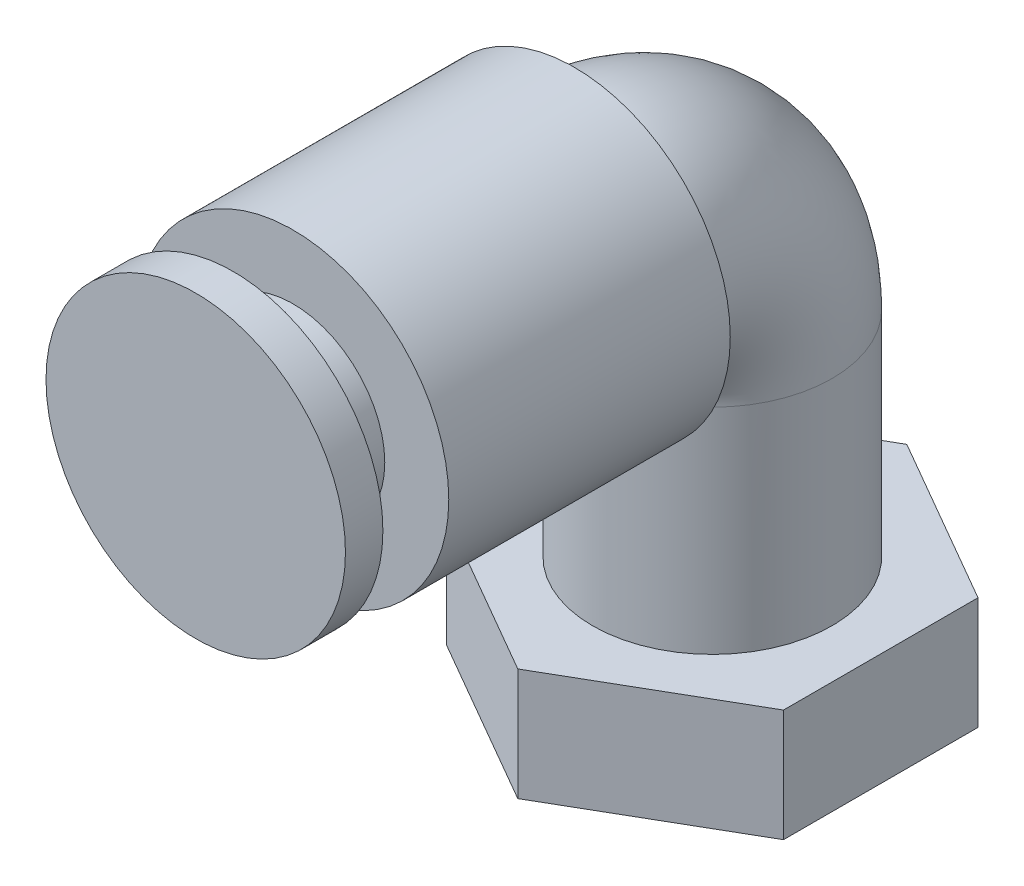
ISO-10303-21;
HEADER;
FILE_DESCRIPTION(('STEP AP214'),'2;1');
FILE_NAME('part.step','',(''),(''),'','','');
FILE_SCHEMA(('AUTOMOTIVE_DESIGN { 1 0 10303 214 1 1 1 1 }'));
ENDSEC;
DATA;
#1=APPLICATION_CONTEXT('core data for automotive mechanical design processes');
#2=APPLICATION_PROTOCOL_DEFINITION('international standard','automotive_design',2000,#1);
#3=PRODUCT_CONTEXT('',#1,'mechanical');
#4=PRODUCT('Part','Part','',(#3));
#5=PRODUCT_RELATED_PRODUCT_CATEGORY('part','',(#4));
#6=PRODUCT_DEFINITION_FORMATION('','',#4);
#7=PRODUCT_DEFINITION_CONTEXT('part definition',#1,'design');
#8=PRODUCT_DEFINITION('design','',#6,#7);
#9=PRODUCT_DEFINITION_SHAPE('','',#8);
#10=(LENGTH_UNIT() NAMED_UNIT(*) SI_UNIT(.MILLI.,.METRE.));
#11=(NAMED_UNIT(*) PLANE_ANGLE_UNIT() SI_UNIT($,.RADIAN.));
#12=(NAMED_UNIT(*) SI_UNIT($,.STERADIAN.) SOLID_ANGLE_UNIT());
#13=UNCERTAINTY_MEASURE_WITH_UNIT(LENGTH_MEASURE(1.E-05),#10,'distance_accuracy_value','');
#14=(GEOMETRIC_REPRESENTATION_CONTEXT(3) GLOBAL_UNCERTAINTY_ASSIGNED_CONTEXT((#13)) GLOBAL_UNIT_ASSIGNED_CONTEXT((#10,
#11,#12)) REPRESENTATION_CONTEXT('',''));
#15=CARTESIAN_POINT('',(0.,0.,0.));
#16=DIRECTION('',(0.,0.,1.));
#17=DIRECTION('',(1.,0.,0.));
#18=AXIS2_PLACEMENT_3D('',#15,#16,#17);
#19=CARTESIAN_POINT('',(0.,19.05,5.207));
#20=DIRECTION('',(0.,0.,1.));
#21=DIRECTION('',(0.,-1.,0.));
#22=AXIS2_PLACEMENT_3D('',#19,#20,#21);
#23=CYLINDRICAL_SURFACE('',#22,5.08);
#24=CARTESIAN_POINT('',(0.,19.05,5.207));
#25=DIRECTION('',(0.,0.,1.));
#26=DIRECTION('',(0.,-1.,0.));
#27=AXIS2_PLACEMENT_3D('',#24,#25,#26);
#28=CIRCLE('',#27,5.08);
#29=CARTESIAN_POINT('',(0.,24.13,5.207));
#30=VERTEX_POINT('',#29);
#31=EDGE_CURVE('E142',#30,#30,#28,.T.);
#32=ORIENTED_EDGE('',*,*,#31,.T.);
#33=EDGE_LOOP('',(#32));
#34=FACE_BOUND('',#33,.T.);
#35=CARTESIAN_POINT('',(0.,19.05,5.842));
#36=DIRECTION('',(0.,0.,1.));
#37=DIRECTION('',(1.,0.,0.));
#38=AXIS2_PLACEMENT_3D('',#35,#36,#37);
#39=CIRCLE('',#38,5.08);
#40=CARTESIAN_POINT('',(5.08,19.05,5.842));
#41=VERTEX_POINT('',#40);
#42=EDGE_CURVE('E53',#41,#41,#39,.F.);
#43=ORIENTED_EDGE('',*,*,#42,.T.);
#44=EDGE_LOOP('',(#43));
#45=FACE_BOUND('',#44,.T.);
#46=ADVANCED_FACE('F49',(#34,#45),#23,.T.);
#47=CARTESIAN_POINT('',(7.14374999999995,4.7625,-4.12444598552347));
#48=DIRECTION('',(-0.499999999999995,0.,0.866025403784441));
#49=DIRECTION('',(0.866025403784441,0.,0.499999999999995));
#50=AXIS2_PLACEMENT_3D('',#47,#48,#49);
#51=PLANE('',#50);
#52=DIRECTION('',(-0.866025403784442,0.,-0.499999999999995));
#53=VECTOR('',#52,1.);
#54=CARTESIAN_POINT('',(7.14374999999995,0.,-4.12444598552347));
#55=LINE('',#54,#53);
#56=CARTESIAN_POINT('',(7.14374999999995,0.,-4.12444598552347));
#57=VERTEX_POINT('',#56);
#58=CARTESIAN_POINT('',(0.,0.,-8.24889197104678));
#59=VERTEX_POINT('',#58);
#60=EDGE_CURVE('E138',#57,#59,#55,.T.);
#61=ORIENTED_EDGE('',*,*,#60,.T.);
#62=DIRECTION('',(0.,-1.,0.));
#63=VECTOR('',#62,1.);
#64=CARTESIAN_POINT('',(0.,4.7625,-8.24889197104678));
#65=LINE('',#64,#63);
#66=CARTESIAN_POINT('',(0.,4.7625,-8.24889197104678));
#67=VERTEX_POINT('',#66);
#68=EDGE_CURVE('E155',#67,#59,#65,.T.);
#69=ORIENTED_EDGE('',*,*,#68,.F.);
#70=DIRECTION('',(-0.866025403784442,0.,-0.499999999999995));
#71=VECTOR('',#70,1.);
#72=CARTESIAN_POINT('',(7.14374999999995,4.7625,-4.12444598552347));
#73=LINE('',#72,#71);
#74=CARTESIAN_POINT('',(7.14374999999995,4.7625,-4.12444598552347));
#75=VERTEX_POINT('',#74);
#76=EDGE_CURVE('E149',#75,#67,#73,.T.);
#77=ORIENTED_EDGE('',*,*,#76,.F.);
#78=DIRECTION('',(0.,-1.,0.));
#79=VECTOR('',#78,1.);
#80=CARTESIAN_POINT('',(7.14374999999995,4.7625,-4.12444598552347));
#81=LINE('',#80,#79);
#82=EDGE_CURVE('E134',#75,#57,#81,.T.);
#83=ORIENTED_EDGE('',*,*,#82,.T.);
#84=EDGE_LOOP('',(#61,#69,#77,#83));
#85=FACE_BOUND('',#84,.T.);
#86=ADVANCED_FACE('F51',(#85),#51,.F.);
#87=CARTESIAN_POINT('',(0.,4.7625,-8.24889197104678));
#88=DIRECTION('',(0.500000000000001,0.,0.866025403784438));
#89=DIRECTION('',(0.866025403784438,0.,-0.500000000000001));
#90=AXIS2_PLACEMENT_3D('',#87,#88,#89);
#91=PLANE('',#90);
#92=DIRECTION('',(-0.866025403784438,0.,0.500000000000001));
#93=VECTOR('',#92,1.);
#94=CARTESIAN_POINT('',(0.,0.,-8.24889197104678));
#95=LINE('',#94,#93);
#96=CARTESIAN_POINT('',(-7.14375000000001,0.,-4.12444598552337));
#97=VERTEX_POINT('',#96);
#98=EDGE_CURVE('E141',#59,#97,#95,.T.);
#99=ORIENTED_EDGE('',*,*,#98,.T.);
#100=DIRECTION('',(0.,-1.,0.));
#101=VECTOR('',#100,1.);
#102=CARTESIAN_POINT('',(-7.14375000000001,4.7625,-4.12444598552337));
#103=LINE('',#102,#101);
#104=CARTESIAN_POINT('',(-7.14375000000001,4.7625,-4.12444598552337));
#105=VERTEX_POINT('',#104);
#106=EDGE_CURVE('E153',#105,#97,#103,.T.);
#107=ORIENTED_EDGE('',*,*,#106,.F.);
#108=DIRECTION('',(-0.866025403784438,0.,0.500000000000001));
#109=VECTOR('',#108,1.);
#110=CARTESIAN_POINT('',(0.,4.7625,-8.24889197104678));
#111=LINE('',#110,#109);
#112=EDGE_CURVE('E107',#67,#105,#111,.T.);
#113=ORIENTED_EDGE('',*,*,#112,.F.);
#114=ORIENTED_EDGE('',*,*,#68,.T.);
#115=EDGE_LOOP('',(#99,#107,#113,#114));
#116=FACE_BOUND('',#115,.T.);
#117=ADVANCED_FACE('F173',(#116),#91,.F.);
#118=CARTESIAN_POINT('',(-7.14375000000001,4.7625,-4.12444598552337));
#119=DIRECTION('',(1.,0.,0.));
#120=DIRECTION('',(0.,0.,-1.));
#121=AXIS2_PLACEMENT_3D('',#118,#119,#120);
#122=PLANE('',#121);
#123=DIRECTION('',(0.,0.,1.));
#124=VECTOR('',#123,1.);
#125=CARTESIAN_POINT('',(-7.14375000000001,0.,-4.12444598552337));
#126=LINE('',#125,#124);
#127=CARTESIAN_POINT('',(-7.14374999999998,0.,4.12444598552342));
#128=VERTEX_POINT('',#127);
#129=EDGE_CURVE('E144',#97,#128,#126,.T.);
#130=ORIENTED_EDGE('',*,*,#129,.T.);
#131=DIRECTION('',(0.,-1.,0.));
#132=VECTOR('',#131,1.);
#133=CARTESIAN_POINT('',(-7.14374999999998,4.7625,4.12444598552342));
#134=LINE('',#133,#132);
#135=CARTESIAN_POINT('',(-7.14374999999998,4.7625,4.12444598552342));
#136=VERTEX_POINT('',#135);
#137=EDGE_CURVE('E129',#136,#128,#134,.T.);
#138=ORIENTED_EDGE('',*,*,#137,.F.);
#139=DIRECTION('',(0.,0.,1.));
#140=VECTOR('',#139,1.);
#141=CARTESIAN_POINT('',(-7.14375000000001,4.7625,-4.12444598552337));
#142=LINE('',#141,#140);
#143=EDGE_CURVE('E120',#105,#136,#142,.T.);
#144=ORIENTED_EDGE('',*,*,#143,.F.);
#145=ORIENTED_EDGE('',*,*,#106,.T.);
#146=EDGE_LOOP('',(#130,#138,#144,#145));
#147=FACE_BOUND('',#146,.T.);
#148=ADVANCED_FACE('F176',(#147),#122,.F.);
#149=CARTESIAN_POINT('',(-7.14374999999998,4.7625,4.12444598552342));
#150=DIRECTION('',(0.499999999999995,0.,-0.866025403784442));
#151=DIRECTION('',(-0.866025403784442,0.,-0.499999999999995));
#152=AXIS2_PLACEMENT_3D('',#149,#150,#151);
#153=PLANE('',#152);
#154=DIRECTION('',(0.866025403784442,0.,0.499999999999995));
#155=VECTOR('',#154,1.);
#156=CARTESIAN_POINT('',(-7.14374999999998,0.,4.12444598552342));
#157=LINE('',#156,#155);
#158=CARTESIAN_POINT('',(0.,0.,8.24889197104678));
#159=VERTEX_POINT('',#158);
#160=EDGE_CURVE('E128',#128,#159,#157,.T.);
#161=ORIENTED_EDGE('',*,*,#160,.T.);
#162=DIRECTION('',(0.,-1.,0.));
#163=VECTOR('',#162,1.);
#164=CARTESIAN_POINT('',(0.,4.7625,8.24889197104678));
#165=LINE('',#164,#163);
#166=CARTESIAN_POINT('',(0.,4.7625,8.24889197104678));
#167=VERTEX_POINT('',#166);
#168=EDGE_CURVE('E125',#167,#159,#165,.T.);
#169=ORIENTED_EDGE('',*,*,#168,.F.);
#170=DIRECTION('',(0.866025403784442,0.,0.499999999999995));
#171=VECTOR('',#170,1.);
#172=CARTESIAN_POINT('',(-7.14374999999998,4.7625,4.12444598552342));
#173=LINE('',#172,#171);
#174=EDGE_CURVE('E114',#136,#167,#173,.T.);
#175=ORIENTED_EDGE('',*,*,#174,.F.);
#176=ORIENTED_EDGE('',*,*,#137,.T.);
#177=EDGE_LOOP('',(#161,#169,#175,#176));
#178=FACE_BOUND('',#177,.T.);
#179=ADVANCED_FACE('F126',(#178),#153,.F.);
#180=CARTESIAN_POINT('',(0.,4.7625,8.24889197104678));
#181=DIRECTION('',(-0.500000000000007,0.,-0.866025403784435));
#182=DIRECTION('',(-0.866025403784435,0.,0.500000000000007));
#183=AXIS2_PLACEMENT_3D('',#180,#181,#182);
#184=PLANE('',#183);
#185=DIRECTION('',(0.866025403784435,0.,-0.500000000000007));
#186=VECTOR('',#185,1.);
#187=CARTESIAN_POINT('',(0.,0.,8.24889197104678));
#188=LINE('',#187,#186);
#189=CARTESIAN_POINT('',(7.14375000000004,0.,4.12444598552332));
#190=VERTEX_POINT('',#189);
#191=EDGE_CURVE('E92',#159,#190,#188,.T.);
#192=ORIENTED_EDGE('',*,*,#191,.T.);
#193=DIRECTION('',(0.,-1.,0.));
#194=VECTOR('',#193,1.);
#195=CARTESIAN_POINT('',(7.14375000000004,4.7625,4.12444598552332));
#196=LINE('',#195,#194);
#197=CARTESIAN_POINT('',(7.14375000000004,4.7625,4.12444598552332));
#198=VERTEX_POINT('',#197);
#199=EDGE_CURVE('E130',#198,#190,#196,.T.);
#200=ORIENTED_EDGE('',*,*,#199,.F.);
#201=DIRECTION('',(0.866025403784435,0.,-0.500000000000007));
#202=VECTOR('',#201,1.);
#203=CARTESIAN_POINT('',(0.,4.7625,8.24889197104678));
#204=LINE('',#203,#202);
#205=EDGE_CURVE('E118',#167,#198,#204,.T.);
#206=ORIENTED_EDGE('',*,*,#205,.F.);
#207=ORIENTED_EDGE('',*,*,#168,.T.);
#208=EDGE_LOOP('',(#192,#200,#206,#207));
#209=FACE_BOUND('',#208,.T.);
#210=ADVANCED_FACE('F132',(#209),#184,.F.);
#211=CARTESIAN_POINT('',(7.14375000000004,4.7625,4.12444598552332));
#212=DIRECTION('',(-1.,0.,0.));
#213=DIRECTION('',(0.,0.,1.));
#214=AXIS2_PLACEMENT_3D('',#211,#212,#213);
#215=PLANE('',#214);
#216=DIRECTION('',(0.,0.,-1.));
#217=VECTOR('',#216,1.);
#218=CARTESIAN_POINT('',(7.14375000000004,0.,4.12444598552332));
#219=LINE('',#218,#217);
#220=EDGE_CURVE('E98',#190,#57,#219,.T.);
#221=ORIENTED_EDGE('',*,*,#220,.T.);
#222=ORIENTED_EDGE('',*,*,#82,.F.);
#223=DIRECTION('',(0.,0.,-1.));
#224=VECTOR('',#223,1.);
#225=CARTESIAN_POINT('',(7.14375000000004,4.7625,4.12444598552332));
#226=LINE('',#225,#224);
#227=EDGE_CURVE('E69',#198,#75,#226,.T.);
#228=ORIENTED_EDGE('',*,*,#227,.F.);
#229=ORIENTED_EDGE('',*,*,#199,.T.);
#230=EDGE_LOOP('',(#221,#222,#228,#229));
#231=FACE_BOUND('',#230,.T.);
#232=ADVANCED_FACE('F181',(#231),#215,.F.);
#233=CARTESIAN_POINT('',(0.,4.7625,0.));
#234=DIRECTION('',(0.,1.,0.));
#235=DIRECTION('',(0.,0.,1.));
#236=AXIS2_PLACEMENT_3D('',#233,#234,#235);
#237=PLANE('',#236);
#238=CARTESIAN_POINT('',(0.,4.7625,0.));
#239=DIRECTION('',(0.,1.,0.));
#240=DIRECTION('',(0.,0.,1.));
#241=AXIS2_PLACEMENT_3D('',#238,#239,#240);
#242=CIRCLE('',#241,5.08);
#243=CARTESIAN_POINT('',(0.,4.7625,5.08));
#244=VERTEX_POINT('',#243);
#245=EDGE_CURVE('E60',#244,#244,#242,.T.);
#246=ORIENTED_EDGE('',*,*,#245,.F.);
#247=EDGE_LOOP('',(#246));
#248=FACE_BOUND('',#247,.T.);
#249=ORIENTED_EDGE('',*,*,#76,.T.);
#250=ORIENTED_EDGE('',*,*,#112,.T.);
#251=ORIENTED_EDGE('',*,*,#143,.T.);
#252=ORIENTED_EDGE('',*,*,#174,.T.);
#253=ORIENTED_EDGE('',*,*,#205,.T.);
#254=ORIENTED_EDGE('',*,*,#227,.T.);
#255=EDGE_LOOP('',(#249,#250,#251,#252,#253,#254));
#256=FACE_BOUND('',#255,.T.);
#257=ADVANCED_FACE('F116',(#248,#256),#237,.T.);
#258=CARTESIAN_POINT('',(0.,0.,0.));
#259=DIRECTION('',(0.,1.,0.));
#260=DIRECTION('',(0.,0.,1.));
#261=AXIS2_PLACEMENT_3D('',#258,#259,#260);
#262=PLANE('',#261);
#263=ORIENTED_EDGE('',*,*,#60,.F.);
#264=ORIENTED_EDGE('',*,*,#220,.F.);
#265=ORIENTED_EDGE('',*,*,#191,.F.);
#266=ORIENTED_EDGE('',*,*,#160,.F.);
#267=ORIENTED_EDGE('',*,*,#129,.F.);
#268=ORIENTED_EDGE('',*,*,#98,.F.);
#269=EDGE_LOOP('',(#263,#264,#265,#266,#267,#268));
#270=FACE_BOUND('',#269,.T.);
#271=ADVANCED_FACE('F179',(#270),#262,.F.);
#272=CARTESIAN_POINT('',(0.,4.7625,0.));
#273=DIRECTION('',(0.,1.,0.));
#274=DIRECTION('',(0.,0.,1.));
#275=AXIS2_PLACEMENT_3D('',#272,#273,#274);
#276=CYLINDRICAL_SURFACE('',#275,5.08);
#277=CARTESIAN_POINT('',(0.,13.843,0.));
#278=DIRECTION('',(0.,1.,0.));
#279=DIRECTION('',(0.,0.,1.));
#280=AXIS2_PLACEMENT_3D('',#277,#278,#279);
#281=CIRCLE('',#280,5.08);
#282=CARTESIAN_POINT('',(0.,13.843,-5.08));
#283=VERTEX_POINT('',#282);
#284=EDGE_CURVE('E165',#283,#283,#281,.T.);
#285=ORIENTED_EDGE('',*,*,#284,.F.);
#286=EDGE_LOOP('',(#285));
#287=FACE_BOUND('',#286,.T.);
#288=ORIENTED_EDGE('',*,*,#245,.T.);
#289=EDGE_LOOP('',(#288));
#290=FACE_BOUND('',#289,.T.);
#291=ADVANCED_FACE('F211',(#287,#290),#276,.T.);
#292=CARTESIAN_POINT('',(0.,13.843,5.207));
#293=DIRECTION('',(1.,0.,0.));
#294=DIRECTION('',(0.,0.,-1.));
#295=AXIS2_PLACEMENT_3D('',#292,#293,#294);
#296=TOROIDAL_SURFACE('',#295,5.207,5.08);
#297=CARTESIAN_POINT('',(0.,13.843,5.207));
#298=DIRECTION('',(1.,0.,0.));
#299=DIRECTION('',(0.,0.,-1.));
#300=AXIS2_PLACEMENT_3D('',#297,#298,#299);
#301=CIRCLE('',#300,10.287);
#302=EDGE_CURVE('',#283,#30,#301,.T.);
#303=ORIENTED_EDGE('',*,*,#284,.T.);
#304=ORIENTED_EDGE('',*,*,#31,.F.);
#305=ORIENTED_EDGE('',*,*,#302,.T.);
#306=ORIENTED_EDGE('',*,*,#302,.F.);
#307=EDGE_LOOP('',(#303,#305,#304,#306));
#308=FACE_BOUND('',#307,.T.);
#309=ADVANCED_FACE('F203',(#308),#296,.T.);
#310=CARTESIAN_POINT('',(0.,19.05,5.842));
#311=DIRECTION('',(0.,0.,1.));
#312=DIRECTION('',(1.,0.,0.));
#313=AXIS2_PLACEMENT_3D('',#310,#311,#312);
#314=CYLINDRICAL_SURFACE('',#313,6.604);
#315=CARTESIAN_POINT('',(0.,19.05,5.842));
#316=DIRECTION('',(0.,0.,1.));
#317=DIRECTION('',(1.,0.,0.));
#318=AXIS2_PLACEMENT_3D('',#315,#316,#317);
#319=CIRCLE('',#318,6.604);
#320=CARTESIAN_POINT('',(6.604,19.05,5.842));
#321=VERTEX_POINT('',#320);
#322=EDGE_CURVE('E261',#321,#321,#319,.T.);
#323=ORIENTED_EDGE('',*,*,#322,.T.);
#324=EDGE_LOOP('',(#323));
#325=FACE_BOUND('',#324,.T.);
#326=CARTESIAN_POINT('',(0.,19.05,17.78));
#327=DIRECTION('',(0.,0.,1.));
#328=DIRECTION('',(1.,0.,0.));
#329=AXIS2_PLACEMENT_3D('',#326,#327,#328);
#330=CIRCLE('',#329,6.604);
#331=CARTESIAN_POINT('',(6.604,19.05,17.78));
#332=VERTEX_POINT('',#331);
#333=EDGE_CURVE('E163',#332,#332,#330,.T.);
#334=ORIENTED_EDGE('',*,*,#333,.F.);
#335=EDGE_LOOP('',(#334));
#336=FACE_BOUND('',#335,.T.);
#337=ADVANCED_FACE('F217',(#325,#336),#314,.T.);
#338=CARTESIAN_POINT('',(0.,19.05,5.842));
#339=DIRECTION('',(0.,0.,1.));
#340=DIRECTION('',(1.,0.,0.));
#341=AXIS2_PLACEMENT_3D('',#338,#339,#340);
#342=PLANE('',#341);
#343=ORIENTED_EDGE('',*,*,#42,.F.);
#344=EDGE_LOOP('',(#343));
#345=FACE_BOUND('',#344,.T.);
#346=ORIENTED_EDGE('',*,*,#322,.F.);
#347=EDGE_LOOP('',(#346));
#348=FACE_BOUND('',#347,.T.);
#349=ADVANCED_FACE('F208',(#345,#348),#342,.F.);
#350=CARTESIAN_POINT('',(0.,19.05,17.78));
#351=DIRECTION('',(0.,0.,1.));
#352=DIRECTION('',(0.,-1.,0.));
#353=AXIS2_PLACEMENT_3D('',#350,#351,#352);
#354=PLANE('',#353);
#355=CARTESIAN_POINT('',(0.,19.05,17.78));
#356=DIRECTION('',(0.,0.,1.));
#357=DIRECTION('',(1.,0.,0.));
#358=AXIS2_PLACEMENT_3D('',#355,#356,#357);
#359=CIRCLE('',#358,3.88983697323159);
#360=CARTESIAN_POINT('',(3.88983697323159,19.05,17.78));
#361=VERTEX_POINT('',#360);
#362=EDGE_CURVE('E11',#361,#361,#359,.T.);
#363=ORIENTED_EDGE('',*,*,#362,.F.);
#364=EDGE_LOOP('',(#363));
#365=FACE_BOUND('',#364,.T.);
#366=ORIENTED_EDGE('',*,*,#333,.T.);
#367=EDGE_LOOP('',(#366));
#368=FACE_BOUND('',#367,.T.);
#369=ADVANCED_FACE('F205',(#365,#368),#354,.T.);
#370=CARTESIAN_POINT('',(0.,19.05,20.32));
#371=DIRECTION('',(0.,0.,-1.));
#372=DIRECTION('',(-1.,0.,0.));
#373=AXIS2_PLACEMENT_3D('',#370,#371,#372);
#374=CYLINDRICAL_SURFACE('',#373,3.88983697323159);
#375=CARTESIAN_POINT('',(0.,19.05,20.32));
#376=DIRECTION('',(0.,0.,1.));
#377=DIRECTION('',(1.,0.,0.));
#378=AXIS2_PLACEMENT_3D('',#375,#376,#377);
#379=CIRCLE('',#378,3.88983697323159);
#380=CARTESIAN_POINT('',(3.88983697323159,19.05,20.32));
#381=VERTEX_POINT('',#380);
#382=EDGE_CURVE('E252',#381,#381,#379,.T.);
#383=ORIENTED_EDGE('',*,*,#382,.F.);
#384=EDGE_LOOP('',(#383));
#385=FACE_BOUND('',#384,.T.);
#386=ORIENTED_EDGE('',*,*,#362,.T.);
#387=EDGE_LOOP('',(#386));
#388=FACE_BOUND('',#387,.T.);
#389=ADVANCED_FACE('F207',(#385,#388),#374,.T.);
#390=CARTESIAN_POINT('',(0.,19.05,21.9075));
#391=DIRECTION('',(0.,0.,-1.));
#392=DIRECTION('',(-1.,0.,0.));
#393=AXIS2_PLACEMENT_3D('',#390,#391,#392);
#394=CYLINDRICAL_SURFACE('',#393,6.35);
#395=CARTESIAN_POINT('',(0.,19.05,21.9075));
#396=DIRECTION('',(0.,0.,1.));
#397=DIRECTION('',(1.,0.,0.));
#398=AXIS2_PLACEMENT_3D('',#395,#396,#397);
#399=CIRCLE('',#398,6.35);
#400=CARTESIAN_POINT('',(6.35,19.05,21.9075));
#401=VERTEX_POINT('',#400);
#402=EDGE_CURVE('E250',#401,#401,#399,.T.);
#403=ORIENTED_EDGE('',*,*,#402,.F.);
#404=EDGE_LOOP('',(#403));
#405=FACE_BOUND('',#404,.T.);
#406=CARTESIAN_POINT('',(0.,19.05,20.32));
#407=DIRECTION('',(0.,0.,1.));
#408=DIRECTION('',(1.,0.,0.));
#409=AXIS2_PLACEMENT_3D('',#406,#407,#408);
#410=CIRCLE('',#409,6.35);
#411=CARTESIAN_POINT('',(6.35,19.05,20.32));
#412=VERTEX_POINT('',#411);
#413=EDGE_CURVE('E253',#412,#412,#410,.T.);
#414=ORIENTED_EDGE('',*,*,#413,.T.);
#415=EDGE_LOOP('',(#414));
#416=FACE_BOUND('',#415,.T.);
#417=ADVANCED_FACE('F234',(#405,#416),#394,.T.);
#418=CARTESIAN_POINT('',(0.,19.05,21.9075));
#419=DIRECTION('',(0.,0.,1.));
#420=DIRECTION('',(1.,0.,0.));
#421=AXIS2_PLACEMENT_3D('',#418,#419,#420);
#422=PLANE('',#421);
#423=ORIENTED_EDGE('',*,*,#402,.T.);
#424=EDGE_LOOP('',(#423));
#425=FACE_BOUND('',#424,.T.);
#426=ADVANCED_FACE('F238',(#425),#422,.T.);
#427=CARTESIAN_POINT('',(0.,19.05,20.32));
#428=DIRECTION('',(0.,0.,1.));
#429=DIRECTION('',(1.,0.,0.));
#430=AXIS2_PLACEMENT_3D('',#427,#428,#429);
#431=PLANE('',#430);
#432=ORIENTED_EDGE('',*,*,#382,.T.);
#433=EDGE_LOOP('',(#432));
#434=FACE_BOUND('',#433,.T.);
#435=ORIENTED_EDGE('',*,*,#413,.F.);
#436=EDGE_LOOP('',(#435));
#437=FACE_BOUND('',#436,.T.);
#438=ADVANCED_FACE('F240',(#434,#437),#431,.F.);
#439=CLOSED_SHELL('',(#46,#86,#117,#148,#179,#210,#232,#257,#271,#291,#309,#337,#349,#369,#389,
#417,#426,#438));
#440=MANIFOLD_SOLID_BREP('B2',#439);
#441=ADVANCED_BREP_SHAPE_REPRESENTATION('',(#18,#440),#14);
#442=SHAPE_DEFINITION_REPRESENTATION(#9,#441);
ENDSEC;
END-ISO-10303-21;
